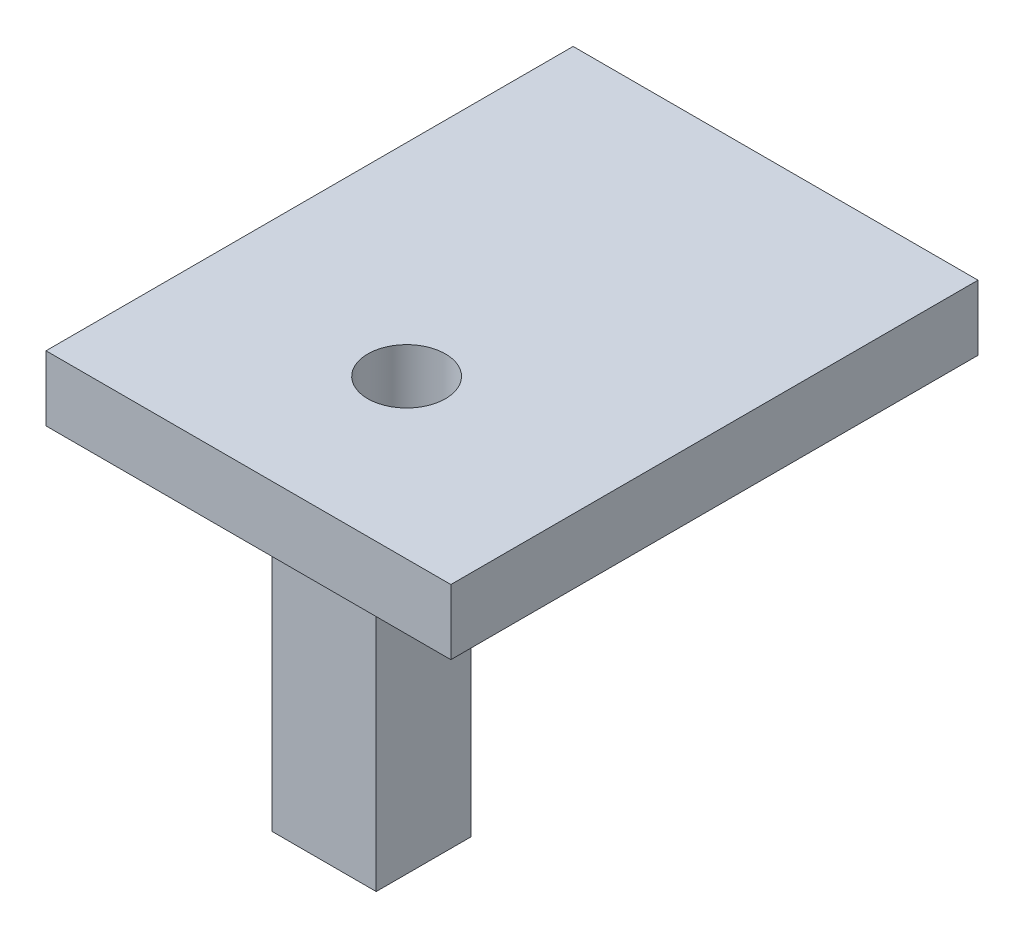
ISO-10303-21;
HEADER;
FILE_DESCRIPTION(('STEP AP214'),'2;1');
FILE_NAME('part.step','',(''),(''),'','','');
FILE_SCHEMA(('AUTOMOTIVE_DESIGN { 1 0 10303 214 1 1 1 1 }'));
ENDSEC;
DATA;
#1=APPLICATION_CONTEXT('core data for automotive mechanical design processes');
#2=APPLICATION_PROTOCOL_DEFINITION('international standard','automotive_design',2000,#1);
#3=PRODUCT_CONTEXT('',#1,'mechanical');
#4=PRODUCT('Part','Part','',(#3));
#5=PRODUCT_RELATED_PRODUCT_CATEGORY('part','',(#4));
#6=PRODUCT_DEFINITION_FORMATION('','',#4);
#7=PRODUCT_DEFINITION_CONTEXT('part definition',#1,'design');
#8=PRODUCT_DEFINITION('design','',#6,#7);
#9=PRODUCT_DEFINITION_SHAPE('','',#8);
#10=(LENGTH_UNIT() NAMED_UNIT(*) SI_UNIT(.MILLI.,.METRE.));
#11=(NAMED_UNIT(*) PLANE_ANGLE_UNIT() SI_UNIT($,.RADIAN.));
#12=(NAMED_UNIT(*) SI_UNIT($,.STERADIAN.) SOLID_ANGLE_UNIT());
#13=UNCERTAINTY_MEASURE_WITH_UNIT(LENGTH_MEASURE(1.E-05),#10,'distance_accuracy_value','');
#14=(GEOMETRIC_REPRESENTATION_CONTEXT(3) GLOBAL_UNCERTAINTY_ASSIGNED_CONTEXT((#13)) GLOBAL_UNIT_ASSIGNED_CONTEXT((#10,
#11,#12)) REPRESENTATION_CONTEXT('',''));
#15=CARTESIAN_POINT('',(0.,0.,0.));
#16=DIRECTION('',(0.,0.,1.));
#17=DIRECTION('',(1.,0.,0.));
#18=AXIS2_PLACEMENT_3D('',#15,#16,#17);
#19=CARTESIAN_POINT('',(0.,0.,0.));
#20=DIRECTION('',(0.,1.,0.));
#21=DIRECTION('',(0.,0.,1.));
#22=AXIS2_PLACEMENT_3D('',#19,#20,#21);
#23=PLANE('',#22);
#24=CARTESIAN_POINT('',(0.,0.,16.192065));
#25=DIRECTION('',(0.,1.,0.));
#26=DIRECTION('',(0.,0.,1.));
#27=AXIS2_PLACEMENT_3D('',#24,#25,#26);
#28=CIRCLE('',#27,5.969);
#29=CARTESIAN_POINT('',(0.,0.,22.161065));
#30=VERTEX_POINT('',#29);
#31=EDGE_CURVE('E139',#30,#30,#28,.T.);
#32=ORIENTED_EDGE('',*,*,#31,.T.);
#33=EDGE_LOOP('',(#32));
#34=FACE_BOUND('',#33,.T.);
#35=DIRECTION('',(1.,0.,0.));
#36=VECTOR('',#35,1.);
#37=CARTESIAN_POINT('',(-15.1,0.,-8.792065));
#38=LINE('',#37,#36);
#39=CARTESIAN_POINT('',(-31.1,0.,-8.79206500000001));
#40=VERTEX_POINT('',#39);
#41=CARTESIAN_POINT('',(-15.1,0.,-8.792065));
#42=VERTEX_POINT('',#41);
#43=EDGE_CURVE('E130',#40,#42,#38,.T.);
#44=ORIENTED_EDGE('',*,*,#43,.F.);
#45=DIRECTION('',(0.,0.,1.));
#46=VECTOR('',#45,1.);
#47=CARTESIAN_POINT('',(-31.1,0.,-40.492065));
#48=LINE('',#47,#46);
#49=CARTESIAN_POINT('',(-31.1,0.,-40.492065));
#50=VERTEX_POINT('',#49);
#51=EDGE_CURVE('E171',#50,#40,#48,.T.);
#52=ORIENTED_EDGE('',*,*,#51,.F.);
#53=DIRECTION('',(-1.,0.,0.));
#54=VECTOR('',#53,1.);
#55=CARTESIAN_POINT('',(-31.1,0.,-40.492065));
#56=LINE('',#55,#54);
#57=CARTESIAN_POINT('',(31.1,0.,-40.492065));
#58=VERTEX_POINT('',#57);
#59=EDGE_CURVE('E167',#58,#50,#56,.T.);
#60=ORIENTED_EDGE('',*,*,#59,.F.);
#61=DIRECTION('',(0.,0.,-1.));
#62=VECTOR('',#61,1.);
#63=CARTESIAN_POINT('',(31.1,0.,-40.492065));
#64=LINE('',#63,#62);
#65=CARTESIAN_POINT('',(31.1,0.,40.492065));
#66=VERTEX_POINT('',#65);
#67=EDGE_CURVE('E147',#66,#58,#64,.T.);
#68=ORIENTED_EDGE('',*,*,#67,.F.);
#69=DIRECTION('',(1.,0.,0.));
#70=VECTOR('',#69,1.);
#71=CARTESIAN_POINT('',(-31.1,0.,40.492065));
#72=LINE('',#71,#70);
#73=CARTESIAN_POINT('',(-31.1,0.,40.492065));
#74=VERTEX_POINT('',#73);
#75=EDGE_CURVE('E154',#74,#66,#72,.T.);
#76=ORIENTED_EDGE('',*,*,#75,.F.);
#77=CARTESIAN_POINT('',(-31.1,0.,5.76057499999999));
#78=VERTEX_POINT('',#77);
#79=EDGE_CURVE('E170',#78,#74,#48,.T.);
#80=ORIENTED_EDGE('',*,*,#79,.F.);
#81=DIRECTION('',(-1.,0.,0.));
#82=VECTOR('',#81,1.);
#83=CARTESIAN_POINT('',(-15.1,0.,5.760575));
#84=LINE('',#83,#82);
#85=CARTESIAN_POINT('',(-15.1,0.,5.760575));
#86=VERTEX_POINT('',#85);
#87=EDGE_CURVE('E66',#86,#78,#84,.T.);
#88=ORIENTED_EDGE('',*,*,#87,.F.);
#89=DIRECTION('',(0.,0.,1.));
#90=VECTOR('',#89,1.);
#91=CARTESIAN_POINT('',(-15.1,0.,-8.792065));
#92=LINE('',#91,#90);
#93=EDGE_CURVE('E61',#42,#86,#92,.T.);
#94=ORIENTED_EDGE('',*,*,#93,.F.);
#95=EDGE_LOOP('',(#44,#52,#60,#68,#76,#80,#88,#94));
#96=FACE_BOUND('',#95,.T.);
#97=ADVANCED_FACE('F45',(#34,#96),#23,.F.);
#98=CARTESIAN_POINT('',(31.1,10.,-40.492065));
#99=DIRECTION('',(-1.,0.,0.));
#100=DIRECTION('',(0.,0.,1.));
#101=AXIS2_PLACEMENT_3D('',#98,#99,#100);
#102=PLANE('',#101);
#103=ORIENTED_EDGE('',*,*,#67,.T.);
#104=DIRECTION('',(0.,-1.,0.));
#105=VECTOR('',#104,1.);
#106=CARTESIAN_POINT('',(31.1,10.,-40.492065));
#107=LINE('',#106,#105);
#108=CARTESIAN_POINT('',(31.1,10.,-40.492065));
#109=VERTEX_POINT('',#108);
#110=EDGE_CURVE('E11',#109,#58,#107,.T.);
#111=ORIENTED_EDGE('',*,*,#110,.F.);
#112=DIRECTION('',(0.,0.,-1.));
#113=VECTOR('',#112,1.);
#114=CARTESIAN_POINT('',(31.1,10.,-40.492065));
#115=LINE('',#114,#113);
#116=CARTESIAN_POINT('',(31.1,10.,40.492065));
#117=VERTEX_POINT('',#116);
#118=EDGE_CURVE('E149',#117,#109,#115,.T.);
#119=ORIENTED_EDGE('',*,*,#118,.F.);
#120=DIRECTION('',(0.,-1.,0.));
#121=VECTOR('',#120,1.);
#122=CARTESIAN_POINT('',(31.1,10.,40.492065));
#123=LINE('',#122,#121);
#124=EDGE_CURVE('E163',#117,#66,#123,.T.);
#125=ORIENTED_EDGE('',*,*,#124,.T.);
#126=EDGE_LOOP('',(#103,#111,#119,#125));
#127=FACE_BOUND('',#126,.T.);
#128=ADVANCED_FACE('F47',(#127),#102,.F.);
#129=CARTESIAN_POINT('',(-31.1,10.,-40.492065));
#130=DIRECTION('',(0.,0.,1.));
#131=DIRECTION('',(1.,0.,0.));
#132=AXIS2_PLACEMENT_3D('',#129,#130,#131);
#133=PLANE('',#132);
#134=ORIENTED_EDGE('',*,*,#59,.T.);
#135=DIRECTION('',(0.,-1.,0.));
#136=VECTOR('',#135,1.);
#137=CARTESIAN_POINT('',(-31.1,10.,-40.492065));
#138=LINE('',#137,#136);
#139=CARTESIAN_POINT('',(-31.1,10.,-40.492065));
#140=VERTEX_POINT('',#139);
#141=EDGE_CURVE('E54',#140,#50,#138,.T.);
#142=ORIENTED_EDGE('',*,*,#141,.F.);
#143=DIRECTION('',(-1.,0.,0.));
#144=VECTOR('',#143,1.);
#145=CARTESIAN_POINT('',(-31.1,10.,-40.492065));
#146=LINE('',#145,#144);
#147=EDGE_CURVE('E153',#109,#140,#146,.T.);
#148=ORIENTED_EDGE('',*,*,#147,.F.);
#149=ORIENTED_EDGE('',*,*,#110,.T.);
#150=EDGE_LOOP('',(#134,#142,#148,#149));
#151=FACE_BOUND('',#150,.T.);
#152=ADVANCED_FACE('F222',(#151),#133,.F.);
#153=CARTESIAN_POINT('',(-31.1,10.,-40.492065));
#154=DIRECTION('',(1.,0.,0.));
#155=DIRECTION('',(0.,0.,-1.));
#156=AXIS2_PLACEMENT_3D('',#153,#154,#155);
#157=PLANE('',#156);
#158=ORIENTED_EDGE('',*,*,#51,.T.);
#159=DIRECTION('',(0.,1.,0.));
#160=VECTOR('',#159,1.);
#161=CARTESIAN_POINT('',(-31.1,-71.32,-8.792065));
#162=LINE('',#161,#160);
#163=CARTESIAN_POINT('',(-31.1,-71.32,-8.792065));
#164=VERTEX_POINT('',#163);
#165=EDGE_CURVE('E141',#164,#40,#162,.T.);
#166=ORIENTED_EDGE('',*,*,#165,.F.);
#167=DIRECTION('',(0.,0.,-1.));
#168=VECTOR('',#167,1.);
#169=CARTESIAN_POINT('',(-31.1,-71.32,-8.792065));
#170=LINE('',#169,#168);
#171=CARTESIAN_POINT('',(-31.1,-71.32,5.76057499999999));
#172=VERTEX_POINT('',#171);
#173=EDGE_CURVE('E119',#172,#164,#170,.T.);
#174=ORIENTED_EDGE('',*,*,#173,.F.);
#175=DIRECTION('',(0.,1.,0.));
#176=VECTOR('',#175,1.);
#177=CARTESIAN_POINT('',(-31.1,-71.32,5.76057499999999));
#178=LINE('',#177,#176);
#179=EDGE_CURVE('E115',#172,#78,#178,.T.);
#180=ORIENTED_EDGE('',*,*,#179,.T.);
#181=ORIENTED_EDGE('',*,*,#79,.T.);
#182=DIRECTION('',(0.,-1.,0.));
#183=VECTOR('',#182,1.);
#184=CARTESIAN_POINT('',(-31.1,10.,40.492065));
#185=LINE('',#184,#183);
#186=CARTESIAN_POINT('',(-31.1,10.,40.492065));
#187=VERTEX_POINT('',#186);
#188=EDGE_CURVE('E180',#187,#74,#185,.T.);
#189=ORIENTED_EDGE('',*,*,#188,.F.);
#190=DIRECTION('',(0.,0.,1.));
#191=VECTOR('',#190,1.);
#192=CARTESIAN_POINT('',(-31.1,10.,-40.492065));
#193=LINE('',#192,#191);
#194=EDGE_CURVE('E157',#140,#187,#193,.T.);
#195=ORIENTED_EDGE('',*,*,#194,.F.);
#196=ORIENTED_EDGE('',*,*,#141,.T.);
#197=EDGE_LOOP('',(#158,#166,#174,#180,#181,#189,#195,#196));
#198=FACE_BOUND('',#197,.T.);
#199=ADVANCED_FACE('F189',(#198),#157,.F.);
#200=CARTESIAN_POINT('',(-31.1,10.,40.492065));
#201=DIRECTION('',(0.,0.,-1.));
#202=DIRECTION('',(-1.,0.,0.));
#203=AXIS2_PLACEMENT_3D('',#200,#201,#202);
#204=PLANE('',#203);
#205=ORIENTED_EDGE('',*,*,#75,.T.);
#206=ORIENTED_EDGE('',*,*,#124,.F.);
#207=DIRECTION('',(1.,0.,0.));
#208=VECTOR('',#207,1.);
#209=CARTESIAN_POINT('',(-31.1,10.,40.492065));
#210=LINE('',#209,#208);
#211=EDGE_CURVE('E160',#187,#117,#210,.T.);
#212=ORIENTED_EDGE('',*,*,#211,.F.);
#213=ORIENTED_EDGE('',*,*,#188,.T.);
#214=EDGE_LOOP('',(#205,#206,#212,#213));
#215=FACE_BOUND('',#214,.T.);
#216=ADVANCED_FACE('F215',(#215),#204,.F.);
#217=CARTESIAN_POINT('',(0.,10.,0.));
#218=DIRECTION('',(0.,1.,0.));
#219=DIRECTION('',(0.,0.,1.));
#220=AXIS2_PLACEMENT_3D('',#217,#218,#219);
#221=PLANE('',#220);
#222=CARTESIAN_POINT('',(0.,10.,16.192065));
#223=DIRECTION('',(0.,1.,0.));
#224=DIRECTION('',(0.,0.,1.));
#225=AXIS2_PLACEMENT_3D('',#222,#223,#224);
#226=CIRCLE('',#225,5.969);
#227=CARTESIAN_POINT('',(0.,10.,22.161065));
#228=VERTEX_POINT('',#227);
#229=EDGE_CURVE('E134',#228,#228,#226,.T.);
#230=ORIENTED_EDGE('',*,*,#229,.F.);
#231=EDGE_LOOP('',(#230));
#232=FACE_BOUND('',#231,.T.);
#233=ORIENTED_EDGE('',*,*,#118,.T.);
#234=ORIENTED_EDGE('',*,*,#147,.T.);
#235=ORIENTED_EDGE('',*,*,#194,.T.);
#236=ORIENTED_EDGE('',*,*,#211,.T.);
#237=EDGE_LOOP('',(#233,#234,#235,#236));
#238=FACE_BOUND('',#237,.T.);
#239=ADVANCED_FACE('F221',(#232,#238),#221,.T.);
#240=CARTESIAN_POINT('',(0.,0.,16.192065));
#241=DIRECTION('',(0.,1.,0.));
#242=DIRECTION('',(0.,0.,1.));
#243=AXIS2_PLACEMENT_3D('',#240,#241,#242);
#244=CYLINDRICAL_SURFACE('',#243,5.969);
#245=ORIENTED_EDGE('',*,*,#31,.F.);
#246=EDGE_LOOP('',(#245));
#247=FACE_BOUND('',#246,.T.);
#248=ORIENTED_EDGE('',*,*,#229,.T.);
#249=EDGE_LOOP('',(#248));
#250=FACE_BOUND('',#249,.T.);
#251=ADVANCED_FACE('F242',(#247,#250),#244,.F.);
#252=CARTESIAN_POINT('',(-15.1,-71.32,-8.792065));
#253=DIRECTION('',(-1.,0.,0.));
#254=DIRECTION('',(0.,0.,1.));
#255=AXIS2_PLACEMENT_3D('',#252,#253,#254);
#256=PLANE('',#255);
#257=ORIENTED_EDGE('',*,*,#93,.T.);
#258=DIRECTION('',(0.,1.,0.));
#259=VECTOR('',#258,1.);
#260=CARTESIAN_POINT('',(-15.1,-71.32,5.760575));
#261=LINE('',#260,#259);
#262=CARTESIAN_POINT('',(-15.1,-71.32,5.760575));
#263=VERTEX_POINT('',#262);
#264=EDGE_CURVE('E113',#263,#86,#261,.T.);
#265=ORIENTED_EDGE('',*,*,#264,.F.);
#266=DIRECTION('',(0.,0.,1.));
#267=VECTOR('',#266,1.);
#268=CARTESIAN_POINT('',(-15.1,-71.32,-8.792065));
#269=LINE('',#268,#267);
#270=CARTESIAN_POINT('',(-15.1,-71.32,-8.792065));
#271=VERTEX_POINT('',#270);
#272=EDGE_CURVE('E120',#271,#263,#269,.T.);
#273=ORIENTED_EDGE('',*,*,#272,.F.);
#274=DIRECTION('',(0.,1.,0.));
#275=VECTOR('',#274,1.);
#276=CARTESIAN_POINT('',(-15.1,-71.32,-8.792065));
#277=LINE('',#276,#275);
#278=EDGE_CURVE('E202',#271,#42,#277,.T.);
#279=ORIENTED_EDGE('',*,*,#278,.T.);
#280=EDGE_LOOP('',(#257,#265,#273,#279));
#281=FACE_BOUND('',#280,.T.);
#282=ADVANCED_FACE('F132',(#281),#256,.F.);
#283=CARTESIAN_POINT('',(-15.1,-71.32,5.760575));
#284=DIRECTION('',(0.,0.,-1.));
#285=DIRECTION('',(-1.,0.,0.));
#286=AXIS2_PLACEMENT_3D('',#283,#284,#285);
#287=PLANE('',#286);
#288=ORIENTED_EDGE('',*,*,#87,.T.);
#289=ORIENTED_EDGE('',*,*,#179,.F.);
#290=DIRECTION('',(-1.,0.,0.));
#291=VECTOR('',#290,1.);
#292=CARTESIAN_POINT('',(-15.1,-71.32,5.760575));
#293=LINE('',#292,#291);
#294=EDGE_CURVE('E109',#263,#172,#293,.T.);
#295=ORIENTED_EDGE('',*,*,#294,.F.);
#296=ORIENTED_EDGE('',*,*,#264,.T.);
#297=EDGE_LOOP('',(#288,#289,#295,#296));
#298=FACE_BOUND('',#297,.T.);
#299=ADVANCED_FACE('F111',(#298),#287,.F.);
#300=CARTESIAN_POINT('',(-15.1,-71.32,-8.792065));
#301=DIRECTION('',(0.,0.,1.));
#302=DIRECTION('',(1.,0.,0.));
#303=AXIS2_PLACEMENT_3D('',#300,#301,#302);
#304=PLANE('',#303);
#305=ORIENTED_EDGE('',*,*,#43,.T.);
#306=ORIENTED_EDGE('',*,*,#278,.F.);
#307=DIRECTION('',(1.,0.,0.));
#308=VECTOR('',#307,1.);
#309=CARTESIAN_POINT('',(-15.1,-71.32,-8.792065));
#310=LINE('',#309,#308);
#311=EDGE_CURVE('E125',#164,#271,#310,.T.);
#312=ORIENTED_EDGE('',*,*,#311,.F.);
#313=ORIENTED_EDGE('',*,*,#165,.T.);
#314=EDGE_LOOP('',(#305,#306,#312,#313));
#315=FACE_BOUND('',#314,.T.);
#316=ADVANCED_FACE('F205',(#315),#304,.F.);
#317=CARTESIAN_POINT('',(0.,-71.32,0.));
#318=DIRECTION('',(0.,-1.,0.));
#319=DIRECTION('',(0.,0.,-1.));
#320=AXIS2_PLACEMENT_3D('',#317,#318,#319);
#321=PLANE('',#320);
#322=ORIENTED_EDGE('',*,*,#272,.T.);
#323=ORIENTED_EDGE('',*,*,#294,.T.);
#324=ORIENTED_EDGE('',*,*,#173,.T.);
#325=ORIENTED_EDGE('',*,*,#311,.T.);
#326=EDGE_LOOP('',(#322,#323,#324,#325));
#327=FACE_BOUND('',#326,.T.);
#328=ADVANCED_FACE('F123',(#327),#321,.T.);
#329=CLOSED_SHELL('',(#97,#128,#152,#199,#216,#239,#251,#282,#299,#316,#328));
#330=MANIFOLD_SOLID_BREP('B2',#329);
#331=ADVANCED_BREP_SHAPE_REPRESENTATION('',(#18,#330),#14);
#332=SHAPE_DEFINITION_REPRESENTATION(#9,#331);
ENDSEC;
END-ISO-10303-21;
